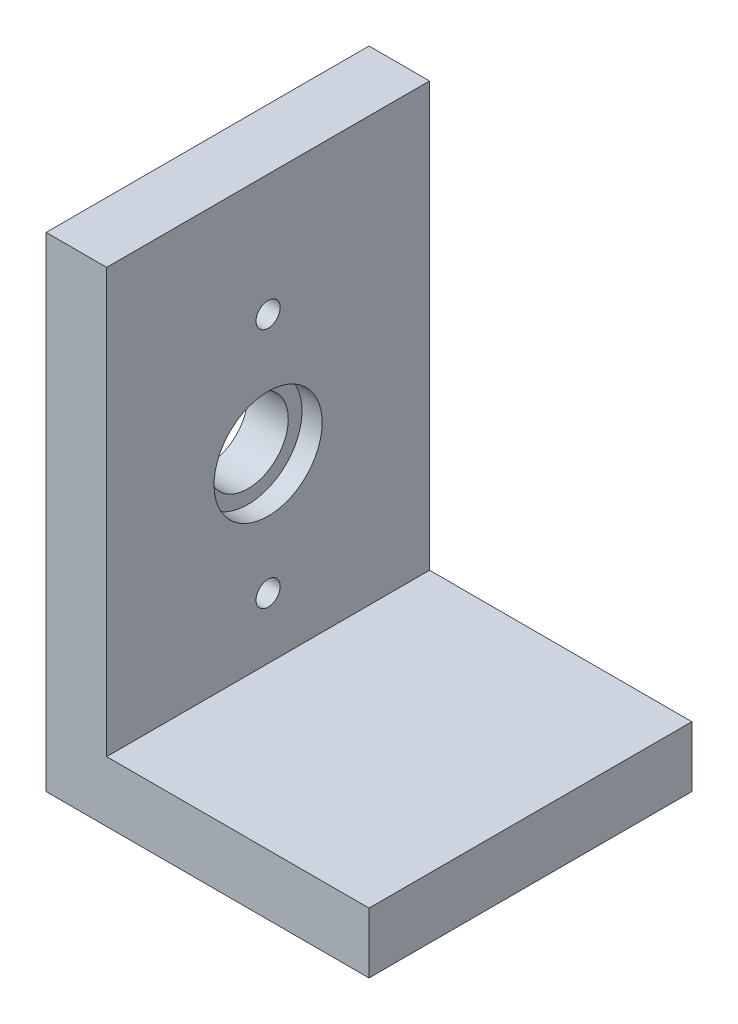
ISO-10303-21;
HEADER;
FILE_DESCRIPTION(('STEP AP214'),'2;1');
FILE_NAME('part.step','',(''),(''),'','','');
FILE_SCHEMA(('AUTOMOTIVE_DESIGN { 1 0 10303 214 1 1 1 1 }'));
ENDSEC;
DATA;
#1=APPLICATION_CONTEXT('core data for automotive mechanical design processes');
#2=APPLICATION_PROTOCOL_DEFINITION('international standard','automotive_design',2000,#1);
#3=PRODUCT_CONTEXT('',#1,'mechanical');
#4=PRODUCT('Part','Part','',(#3));
#5=PRODUCT_RELATED_PRODUCT_CATEGORY('part','',(#4));
#6=PRODUCT_DEFINITION_FORMATION('','',#4);
#7=PRODUCT_DEFINITION_CONTEXT('part definition',#1,'design');
#8=PRODUCT_DEFINITION('design','',#6,#7);
#9=PRODUCT_DEFINITION_SHAPE('','',#8);
#10=(LENGTH_UNIT() NAMED_UNIT(*) SI_UNIT(.MILLI.,.METRE.));
#11=(NAMED_UNIT(*) PLANE_ANGLE_UNIT() SI_UNIT($,.RADIAN.));
#12=(NAMED_UNIT(*) SI_UNIT($,.STERADIAN.) SOLID_ANGLE_UNIT());
#13=UNCERTAINTY_MEASURE_WITH_UNIT(LENGTH_MEASURE(1.E-05),#10,'distance_accuracy_value','');
#14=(GEOMETRIC_REPRESENTATION_CONTEXT(3) GLOBAL_UNCERTAINTY_ASSIGNED_CONTEXT((#13)) GLOBAL_UNIT_ASSIGNED_CONTEXT((#10,
#11,#12)) REPRESENTATION_CONTEXT('',''));
#15=CARTESIAN_POINT('',(0.,0.,0.));
#16=DIRECTION('',(0.,0.,1.));
#17=DIRECTION('',(1.,0.,0.));
#18=AXIS2_PLACEMENT_3D('',#15,#16,#17);
#19=CARTESIAN_POINT('',(50.8,0.,25.4));
#20=DIRECTION('',(0.,1.,0.));
#21=DIRECTION('',(-1.,0.,0.));
#22=AXIS2_PLACEMENT_3D('',#19,#20,#21);
#23=PLANE('',#22);
#24=DIRECTION('',(1.,0.,0.));
#25=VECTOR('',#24,1.);
#26=CARTESIAN_POINT('',(50.8,0.,-25.4));
#27=LINE('',#26,#25);
#28=CARTESIAN_POINT('',(0.,0.,-25.4));
#29=VERTEX_POINT('',#28);
#30=CARTESIAN_POINT('',(50.8,0.,-25.4));
#31=VERTEX_POINT('',#30);
#32=EDGE_CURVE('E119',#29,#31,#27,.T.);
#33=ORIENTED_EDGE('',*,*,#32,.T.);
#34=DIRECTION('',(0.,0.,-1.));
#35=VECTOR('',#34,1.);
#36=CARTESIAN_POINT('',(50.8,0.,25.4));
#37=LINE('',#36,#35);
#38=CARTESIAN_POINT('',(50.8,0.,25.4));
#39=VERTEX_POINT('',#38);
#40=EDGE_CURVE('E11',#39,#31,#37,.T.);
#41=ORIENTED_EDGE('',*,*,#40,.F.);
#42=DIRECTION('',(1.,0.,0.));
#43=VECTOR('',#42,1.);
#44=CARTESIAN_POINT('',(50.8,0.,25.4));
#45=LINE('',#44,#43);
#46=CARTESIAN_POINT('',(0.,0.,25.4));
#47=VERTEX_POINT('',#46);
#48=EDGE_CURVE('E130',#47,#39,#45,.T.);
#49=ORIENTED_EDGE('',*,*,#48,.F.);
#50=DIRECTION('',(0.,0.,-1.));
#51=VECTOR('',#50,1.);
#52=CARTESIAN_POINT('',(0.,0.,25.4));
#53=LINE('',#52,#51);
#54=EDGE_CURVE('E115',#47,#29,#53,.T.);
#55=ORIENTED_EDGE('',*,*,#54,.T.);
#56=EDGE_LOOP('',(#33,#41,#49,#55));
#57=FACE_BOUND('',#56,.T.);
#58=ADVANCED_FACE('F34',(#57),#23,.F.);
#59=CARTESIAN_POINT('',(50.8,9.525,25.4));
#60=DIRECTION('',(-1.,0.,0.));
#61=DIRECTION('',(0.,0.,1.));
#62=AXIS2_PLACEMENT_3D('',#59,#60,#61);
#63=PLANE('',#62);
#64=DIRECTION('',(0.,1.,0.));
#65=VECTOR('',#64,1.);
#66=CARTESIAN_POINT('',(50.8,9.525,-25.4));
#67=LINE('',#66,#65);
#68=CARTESIAN_POINT('',(50.8,9.525,-25.4));
#69=VERTEX_POINT('',#68);
#70=EDGE_CURVE('E122',#31,#69,#67,.T.);
#71=ORIENTED_EDGE('',*,*,#70,.T.);
#72=DIRECTION('',(0.,0.,-1.));
#73=VECTOR('',#72,1.);
#74=CARTESIAN_POINT('',(50.8,9.525,25.4));
#75=LINE('',#74,#73);
#76=CARTESIAN_POINT('',(50.8,9.525,25.4));
#77=VERTEX_POINT('',#76);
#78=EDGE_CURVE('E43',#77,#69,#75,.T.);
#79=ORIENTED_EDGE('',*,*,#78,.F.);
#80=DIRECTION('',(0.,1.,0.));
#81=VECTOR('',#80,1.);
#82=CARTESIAN_POINT('',(50.8,9.525,25.4));
#83=LINE('',#82,#81);
#84=EDGE_CURVE('E88',#39,#77,#83,.T.);
#85=ORIENTED_EDGE('',*,*,#84,.F.);
#86=ORIENTED_EDGE('',*,*,#40,.T.);
#87=EDGE_LOOP('',(#71,#79,#85,#86));
#88=FACE_BOUND('',#87,.T.);
#89=ADVANCED_FACE('F158',(#88),#63,.F.);
#90=CARTESIAN_POINT('',(9.52500000000001,9.525,25.4));
#91=DIRECTION('',(0.,-1.,0.));
#92=DIRECTION('',(0.,0.,-1.));
#93=AXIS2_PLACEMENT_3D('',#90,#91,#92);
#94=PLANE('',#93);
#95=DIRECTION('',(-1.,0.,0.));
#96=VECTOR('',#95,1.);
#97=CARTESIAN_POINT('',(9.52500000000001,9.525,-25.4));
#98=LINE('',#97,#96);
#99=CARTESIAN_POINT('',(9.52500000000001,9.525,-25.4));
#100=VERTEX_POINT('',#99);
#101=EDGE_CURVE('E125',#69,#100,#98,.T.);
#102=ORIENTED_EDGE('',*,*,#101,.T.);
#103=DIRECTION('',(0.,0.,-1.));
#104=VECTOR('',#103,1.);
#105=CARTESIAN_POINT('',(9.52500000000001,9.525,25.4));
#106=LINE('',#105,#104);
#107=CARTESIAN_POINT('',(9.52500000000001,9.525,25.4));
#108=VERTEX_POINT('',#107);
#109=EDGE_CURVE('E110',#108,#100,#106,.T.);
#110=ORIENTED_EDGE('',*,*,#109,.F.);
#111=DIRECTION('',(-1.,0.,0.));
#112=VECTOR('',#111,1.);
#113=CARTESIAN_POINT('',(9.52500000000001,9.525,25.4));
#114=LINE('',#113,#112);
#115=EDGE_CURVE('E101',#77,#108,#114,.T.);
#116=ORIENTED_EDGE('',*,*,#115,.F.);
#117=ORIENTED_EDGE('',*,*,#78,.T.);
#118=EDGE_LOOP('',(#102,#110,#116,#117));
#119=FACE_BOUND('',#118,.T.);
#120=ADVANCED_FACE('F137',(#119),#94,.F.);
#121=CARTESIAN_POINT('',(9.525,76.2,25.4));
#122=DIRECTION('',(-1.,0.,0.));
#123=DIRECTION('',(0.,-1.,0.));
#124=AXIS2_PLACEMENT_3D('',#121,#122,#123);
#125=PLANE('',#124);
#126=CARTESIAN_POINT('',(9.525,57.0992,0.));
#127=DIRECTION('',(1.,0.,0.));
#128=DIRECTION('',(0.,0.,-1.));
#129=AXIS2_PLACEMENT_3D('',#126,#127,#128);
#130=CIRCLE('',#129,1.89865);
#131=CARTESIAN_POINT('',(9.525,57.0992,-1.89865));
#132=VERTEX_POINT('',#131);
#133=EDGE_CURVE('E175',#132,#132,#130,.T.);
#134=ORIENTED_EDGE('',*,*,#133,.F.);
#135=EDGE_LOOP('',(#134));
#136=FACE_BOUND('',#135,.T.);
#137=CARTESIAN_POINT('',(9.52500000000001,19.1008,0.));
#138=DIRECTION('',(1.,0.,0.));
#139=DIRECTION('',(0.,0.,-1.));
#140=AXIS2_PLACEMENT_3D('',#137,#138,#139);
#141=CIRCLE('',#140,1.89865);
#142=CARTESIAN_POINT('',(9.52500000000001,19.1008,-1.89865));
#143=VERTEX_POINT('',#142);
#144=EDGE_CURVE('E179',#143,#143,#141,.T.);
#145=ORIENTED_EDGE('',*,*,#144,.F.);
#146=EDGE_LOOP('',(#145));
#147=FACE_BOUND('',#146,.T.);
#148=CARTESIAN_POINT('',(9.52500000000001,38.1,0.));
#149=DIRECTION('',(1.,0.,0.));
#150=DIRECTION('',(0.,1.,0.));
#151=AXIS2_PLACEMENT_3D('',#148,#149,#150);
#152=CIRCLE('',#151,8.509);
#153=CARTESIAN_POINT('',(9.52500000000001,46.609,0.));
#154=VERTEX_POINT('',#153);
#155=EDGE_CURVE('E182',#154,#154,#152,.T.);
#156=ORIENTED_EDGE('',*,*,#155,.F.);
#157=EDGE_LOOP('',(#156));
#158=FACE_BOUND('',#157,.T.);
#159=DIRECTION('',(0.,1.,0.));
#160=VECTOR('',#159,1.);
#161=CARTESIAN_POINT('',(9.525,76.2,-25.4));
#162=LINE('',#161,#160);
#163=CARTESIAN_POINT('',(9.525,76.2,-25.4));
#164=VERTEX_POINT('',#163);
#165=EDGE_CURVE('E109',#100,#164,#162,.T.);
#166=ORIENTED_EDGE('',*,*,#165,.T.);
#167=DIRECTION('',(0.,0.,-1.));
#168=VECTOR('',#167,1.);
#169=CARTESIAN_POINT('',(9.525,76.2,25.4));
#170=LINE('',#169,#168);
#171=CARTESIAN_POINT('',(9.525,76.2,25.4));
#172=VERTEX_POINT('',#171);
#173=EDGE_CURVE('E106',#172,#164,#170,.T.);
#174=ORIENTED_EDGE('',*,*,#173,.F.);
#175=DIRECTION('',(0.,1.,0.));
#176=VECTOR('',#175,1.);
#177=CARTESIAN_POINT('',(9.525,76.2,25.4));
#178=LINE('',#177,#176);
#179=EDGE_CURVE('E95',#108,#172,#178,.T.);
#180=ORIENTED_EDGE('',*,*,#179,.F.);
#181=ORIENTED_EDGE('',*,*,#109,.T.);
#182=EDGE_LOOP('',(#166,#174,#180,#181));
#183=FACE_BOUND('',#182,.T.);
#184=ADVANCED_FACE('F107',(#136,#147,#158,#183),#125,.F.);
#185=CARTESIAN_POINT('',(0.,76.2,25.4));
#186=DIRECTION('',(0.,-1.,0.));
#187=DIRECTION('',(0.,0.,-1.));
#188=AXIS2_PLACEMENT_3D('',#185,#186,#187);
#189=PLANE('',#188);
#190=DIRECTION('',(-1.,0.,0.));
#191=VECTOR('',#190,1.);
#192=CARTESIAN_POINT('',(0.,76.2,-25.4));
#193=LINE('',#192,#191);
#194=CARTESIAN_POINT('',(0.,76.2,-25.4));
#195=VERTEX_POINT('',#194);
#196=EDGE_CURVE('E74',#164,#195,#193,.T.);
#197=ORIENTED_EDGE('',*,*,#196,.T.);
#198=DIRECTION('',(0.,0.,-1.));
#199=VECTOR('',#198,1.);
#200=CARTESIAN_POINT('',(0.,76.2,25.4));
#201=LINE('',#200,#199);
#202=CARTESIAN_POINT('',(0.,76.2,25.4));
#203=VERTEX_POINT('',#202);
#204=EDGE_CURVE('E111',#203,#195,#201,.T.);
#205=ORIENTED_EDGE('',*,*,#204,.F.);
#206=DIRECTION('',(-1.,0.,0.));
#207=VECTOR('',#206,1.);
#208=CARTESIAN_POINT('',(0.,76.2,25.4));
#209=LINE('',#208,#207);
#210=EDGE_CURVE('E99',#172,#203,#209,.T.);
#211=ORIENTED_EDGE('',*,*,#210,.F.);
#212=ORIENTED_EDGE('',*,*,#173,.T.);
#213=EDGE_LOOP('',(#197,#205,#211,#212));
#214=FACE_BOUND('',#213,.T.);
#215=ADVANCED_FACE('F113',(#214),#189,.F.);
#216=CARTESIAN_POINT('',(0.,0.,25.4));
#217=DIRECTION('',(1.,0.,0.));
#218=DIRECTION('',(0.,0.,-1.));
#219=AXIS2_PLACEMENT_3D('',#216,#217,#218);
#220=PLANE('',#219);
#221=CARTESIAN_POINT('',(0.,57.0992,0.));
#222=DIRECTION('',(1.,0.,0.));
#223=DIRECTION('',(0.,0.,-1.));
#224=AXIS2_PLACEMENT_3D('',#221,#222,#223);
#225=CIRCLE('',#224,1.89864999999999);
#226=CARTESIAN_POINT('',(0.,57.0992,-1.89864999999999));
#227=VERTEX_POINT('',#226);
#228=EDGE_CURVE('E198',#227,#227,#225,.T.);
#229=ORIENTED_EDGE('',*,*,#228,.T.);
#230=EDGE_LOOP('',(#229));
#231=FACE_BOUND('',#230,.T.);
#232=CARTESIAN_POINT('',(0.,19.1008,0.));
#233=DIRECTION('',(1.,0.,0.));
#234=DIRECTION('',(0.,0.,-1.));
#235=AXIS2_PLACEMENT_3D('',#232,#233,#234);
#236=CIRCLE('',#235,1.89865);
#237=CARTESIAN_POINT('',(0.,19.1008,-1.89865));
#238=VERTEX_POINT('',#237);
#239=EDGE_CURVE('E194',#238,#238,#236,.T.);
#240=ORIENTED_EDGE('',*,*,#239,.T.);
#241=EDGE_LOOP('',(#240));
#242=FACE_BOUND('',#241,.T.);
#243=CARTESIAN_POINT('',(0.,38.1,0.));
#244=DIRECTION('',(1.,0.,0.));
#245=DIRECTION('',(0.,1.,0.));
#246=AXIS2_PLACEMENT_3D('',#243,#244,#245);
#247=CIRCLE('',#246,6.35);
#248=CARTESIAN_POINT('',(0.,44.45,0.));
#249=VERTEX_POINT('',#248);
#250=EDGE_CURVE('E188',#249,#249,#247,.T.);
#251=ORIENTED_EDGE('',*,*,#250,.T.);
#252=EDGE_LOOP('',(#251));
#253=FACE_BOUND('',#252,.T.);
#254=DIRECTION('',(0.,-1.,0.));
#255=VECTOR('',#254,1.);
#256=CARTESIAN_POINT('',(0.,0.,-25.4));
#257=LINE('',#256,#255);
#258=EDGE_CURVE('E80',#195,#29,#257,.T.);
#259=ORIENTED_EDGE('',*,*,#258,.T.);
#260=ORIENTED_EDGE('',*,*,#54,.F.);
#261=DIRECTION('',(0.,-1.,0.));
#262=VECTOR('',#261,1.);
#263=CARTESIAN_POINT('',(0.,0.,25.4));
#264=LINE('',#263,#262);
#265=EDGE_CURVE('E51',#203,#47,#264,.T.);
#266=ORIENTED_EDGE('',*,*,#265,.F.);
#267=ORIENTED_EDGE('',*,*,#204,.T.);
#268=EDGE_LOOP('',(#259,#260,#266,#267));
#269=FACE_BOUND('',#268,.T.);
#270=ADVANCED_FACE('F144',(#231,#242,#253,#269),#220,.F.);
#271=CARTESIAN_POINT('',(0.,0.,25.4));
#272=DIRECTION('',(0.,0.,-1.));
#273=DIRECTION('',(-1.,0.,0.));
#274=AXIS2_PLACEMENT_3D('',#271,#272,#273);
#275=PLANE('',#274);
#276=ORIENTED_EDGE('',*,*,#48,.T.);
#277=ORIENTED_EDGE('',*,*,#84,.T.);
#278=ORIENTED_EDGE('',*,*,#115,.T.);
#279=ORIENTED_EDGE('',*,*,#179,.T.);
#280=ORIENTED_EDGE('',*,*,#210,.T.);
#281=ORIENTED_EDGE('',*,*,#265,.T.);
#282=EDGE_LOOP('',(#276,#277,#278,#279,#280,#281));
#283=FACE_BOUND('',#282,.T.);
#284=ADVANCED_FACE('F97',(#283),#275,.F.);
#285=CARTESIAN_POINT('',(0.,0.,-25.4));
#286=DIRECTION('',(0.,0.,-1.));
#287=DIRECTION('',(-1.,0.,0.));
#288=AXIS2_PLACEMENT_3D('',#285,#286,#287);
#289=PLANE('',#288);
#290=ORIENTED_EDGE('',*,*,#32,.F.);
#291=ORIENTED_EDGE('',*,*,#258,.F.);
#292=ORIENTED_EDGE('',*,*,#196,.F.);
#293=ORIENTED_EDGE('',*,*,#165,.F.);
#294=ORIENTED_EDGE('',*,*,#101,.F.);
#295=ORIENTED_EDGE('',*,*,#70,.F.);
#296=EDGE_LOOP('',(#290,#291,#292,#293,#294,#295));
#297=FACE_BOUND('',#296,.T.);
#298=ADVANCED_FACE('F140',(#297),#289,.T.);
#299=CARTESIAN_POINT('',(6.35000000000001,38.1,0.));
#300=DIRECTION('',(1.,0.,0.));
#301=DIRECTION('',(0.,1.,0.));
#302=AXIS2_PLACEMENT_3D('',#299,#300,#301);
#303=CYLINDRICAL_SURFACE('',#302,8.509);
#304=CARTESIAN_POINT('',(6.35000000000001,38.1,0.));
#305=DIRECTION('',(1.,0.,0.));
#306=DIRECTION('',(0.,1.,0.));
#307=AXIS2_PLACEMENT_3D('',#304,#305,#306);
#308=CIRCLE('',#307,8.509);
#309=CARTESIAN_POINT('',(6.35000000000001,46.609,0.));
#310=VERTEX_POINT('',#309);
#311=EDGE_CURVE('E123',#310,#310,#308,.T.);
#312=ORIENTED_EDGE('',*,*,#311,.F.);
#313=EDGE_LOOP('',(#312));
#314=FACE_BOUND('',#313,.T.);
#315=ORIENTED_EDGE('',*,*,#155,.T.);
#316=EDGE_LOOP('',(#315));
#317=FACE_BOUND('',#316,.T.);
#318=ADVANCED_FACE('F219',(#314,#317),#303,.F.);
#319=CARTESIAN_POINT('',(6.35000000000001,38.1,0.));
#320=DIRECTION('',(1.,0.,0.));
#321=DIRECTION('',(0.,1.,0.));
#322=AXIS2_PLACEMENT_3D('',#319,#320,#321);
#323=PLANE('',#322);
#324=CARTESIAN_POINT('',(6.35000000000001,38.1,0.));
#325=DIRECTION('',(1.,0.,0.));
#326=DIRECTION('',(0.,1.,0.));
#327=AXIS2_PLACEMENT_3D('',#324,#325,#326);
#328=CIRCLE('',#327,6.35);
#329=CARTESIAN_POINT('',(6.35000000000001,44.45,0.));
#330=VERTEX_POINT('',#329);
#331=EDGE_CURVE('E37',#330,#330,#328,.T.);
#332=ORIENTED_EDGE('',*,*,#331,.F.);
#333=EDGE_LOOP('',(#332));
#334=FACE_BOUND('',#333,.T.);
#335=ORIENTED_EDGE('',*,*,#311,.T.);
#336=EDGE_LOOP('',(#335));
#337=FACE_BOUND('',#336,.T.);
#338=ADVANCED_FACE('F215',(#334,#337),#323,.T.);
#339=CARTESIAN_POINT('',(0.,38.1,0.));
#340=DIRECTION('',(1.,0.,0.));
#341=DIRECTION('',(0.,1.,0.));
#342=AXIS2_PLACEMENT_3D('',#339,#340,#341);
#343=CYLINDRICAL_SURFACE('',#342,6.35);
#344=ORIENTED_EDGE('',*,*,#331,.T.);
#345=EDGE_LOOP('',(#344));
#346=FACE_BOUND('',#345,.T.);
#347=ORIENTED_EDGE('',*,*,#250,.F.);
#348=EDGE_LOOP('',(#347));
#349=FACE_BOUND('',#348,.T.);
#350=ADVANCED_FACE('F208',(#346,#349),#343,.F.);
#351=CARTESIAN_POINT('',(9.52500000000001,19.1008,0.));
#352=DIRECTION('',(1.,0.,0.));
#353=DIRECTION('',(0.,0.,-1.));
#354=AXIS2_PLACEMENT_3D('',#351,#352,#353);
#355=CYLINDRICAL_SURFACE('',#354,1.89865);
#356=ORIENTED_EDGE('',*,*,#239,.F.);
#357=EDGE_LOOP('',(#356));
#358=FACE_BOUND('',#357,.T.);
#359=ORIENTED_EDGE('',*,*,#144,.T.);
#360=EDGE_LOOP('',(#359));
#361=FACE_BOUND('',#360,.T.);
#362=ADVANCED_FACE('F203',(#358,#361),#355,.F.);
#363=CARTESIAN_POINT('',(9.525,57.0992,0.));
#364=DIRECTION('',(1.,0.,0.));
#365=DIRECTION('',(0.,0.,-1.));
#366=AXIS2_PLACEMENT_3D('',#363,#364,#365);
#367=CYLINDRICAL_SURFACE('',#366,1.89865);
#368=ORIENTED_EDGE('',*,*,#228,.F.);
#369=EDGE_LOOP('',(#368));
#370=FACE_BOUND('',#369,.T.);
#371=ORIENTED_EDGE('',*,*,#133,.T.);
#372=EDGE_LOOP('',(#371));
#373=FACE_BOUND('',#372,.T.);
#374=ADVANCED_FACE('F201',(#370,#373),#367,.F.);
#375=CLOSED_SHELL('',(#58,#89,#120,#184,#215,#270,#284,#298,#318,#338,#350,#362,#374));
#376=MANIFOLD_SOLID_BREP('B2',#375);
#377=ADVANCED_BREP_SHAPE_REPRESENTATION('',(#18,#376),#14);
#378=SHAPE_DEFINITION_REPRESENTATION(#9,#377);
ENDSEC;
END-ISO-10303-21;
